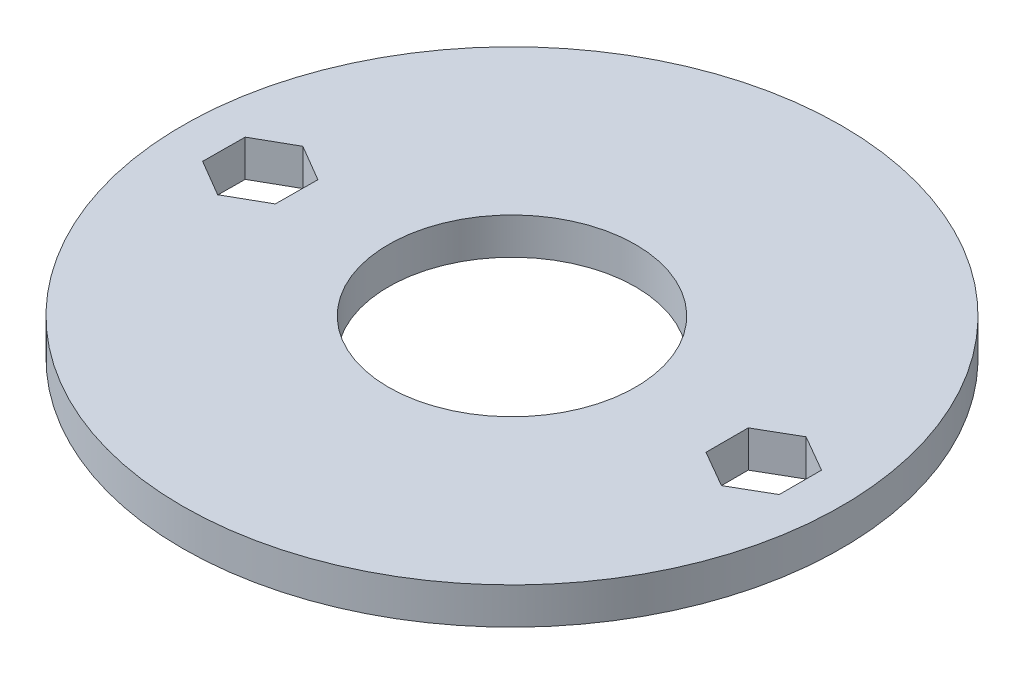
ISO-10303-21;
HEADER;
FILE_DESCRIPTION(('STEP AP214'),'2;1');
FILE_NAME('part.step','',(''),(''),'','','');
FILE_SCHEMA(('AUTOMOTIVE_DESIGN { 1 0 10303 214 1 1 1 1 }'));
ENDSEC;
DATA;
#1=APPLICATION_CONTEXT('core data for automotive mechanical design processes');
#2=APPLICATION_PROTOCOL_DEFINITION('international standard','automotive_design',2000,#1);
#3=PRODUCT_CONTEXT('',#1,'mechanical');
#4=PRODUCT('Part','Part','',(#3));
#5=PRODUCT_RELATED_PRODUCT_CATEGORY('part','',(#4));
#6=PRODUCT_DEFINITION_FORMATION('','',#4);
#7=PRODUCT_DEFINITION_CONTEXT('part definition',#1,'design');
#8=PRODUCT_DEFINITION('design','',#6,#7);
#9=PRODUCT_DEFINITION_SHAPE('','',#8);
#10=(LENGTH_UNIT() NAMED_UNIT(*) SI_UNIT(.MILLI.,.METRE.));
#11=(NAMED_UNIT(*) PLANE_ANGLE_UNIT() SI_UNIT($,.RADIAN.));
#12=(NAMED_UNIT(*) SI_UNIT($,.STERADIAN.) SOLID_ANGLE_UNIT());
#13=UNCERTAINTY_MEASURE_WITH_UNIT(LENGTH_MEASURE(1.E-05),#10,'distance_accuracy_value','');
#14=(GEOMETRIC_REPRESENTATION_CONTEXT(3) GLOBAL_UNCERTAINTY_ASSIGNED_CONTEXT((#13)) GLOBAL_UNIT_ASSIGNED_CONTEXT((#10,
#11,#12)) REPRESENTATION_CONTEXT('',''));
#15=CARTESIAN_POINT('',(0.,0.,0.));
#16=DIRECTION('',(0.,0.,1.));
#17=DIRECTION('',(1.,0.,0.));
#18=AXIS2_PLACEMENT_3D('',#15,#16,#17);
#19=CARTESIAN_POINT('',(0.,4.,0.));
#20=DIRECTION('',(0.,-1.,0.));
#21=DIRECTION('',(0.,0.,-1.));
#22=AXIS2_PLACEMENT_3D('',#19,#20,#21);
#23=CYLINDRICAL_SURFACE('',#22,36.);
#24=CARTESIAN_POINT('',(0.,4.,0.));
#25=DIRECTION('',(0.,1.,0.));
#26=DIRECTION('',(0.,0.,1.));
#27=AXIS2_PLACEMENT_3D('',#24,#25,#26);
#28=CIRCLE('',#27,36.);
#29=CARTESIAN_POINT('',(0.,4.,36.));
#30=VERTEX_POINT('',#29);
#31=EDGE_CURVE('E11',#30,#30,#28,.T.);
#32=ORIENTED_EDGE('',*,*,#31,.F.);
#33=EDGE_LOOP('',(#32));
#34=FACE_BOUND('',#33,.T.);
#35=CARTESIAN_POINT('',(0.,0.,0.));
#36=DIRECTION('',(0.,1.,0.));
#37=DIRECTION('',(0.,0.,1.));
#38=AXIS2_PLACEMENT_3D('',#35,#36,#37);
#39=CIRCLE('',#38,36.);
#40=CARTESIAN_POINT('',(0.,0.,36.));
#41=VERTEX_POINT('',#40);
#42=EDGE_CURVE('E36',#41,#41,#39,.T.);
#43=ORIENTED_EDGE('',*,*,#42,.T.);
#44=EDGE_LOOP('',(#43));
#45=FACE_BOUND('',#44,.T.);
#46=ADVANCED_FACE('F33',(#34,#45),#23,.T.);
#47=CARTESIAN_POINT('',(0.,4.,0.));
#48=DIRECTION('',(0.,1.,0.));
#49=DIRECTION('',(0.,0.,1.));
#50=AXIS2_PLACEMENT_3D('',#47,#48,#49);
#51=PLANE('',#50);
#52=CARTESIAN_POINT('',(0.,4.,0.));
#53=DIRECTION('',(0.,1.,0.));
#54=DIRECTION('',(0.,0.,1.));
#55=AXIS2_PLACEMENT_3D('',#52,#53,#54);
#56=CIRCLE('',#55,13.5);
#57=CARTESIAN_POINT('',(0.,4.,13.5));
#58=VERTEX_POINT('',#57);
#59=EDGE_CURVE('E146',#58,#58,#56,.T.);
#60=ORIENTED_EDGE('',*,*,#59,.F.);
#61=EDGE_LOOP('',(#60));
#62=FACE_BOUND('',#61,.T.);
#63=DIRECTION('',(0.866025403784439,0.,0.5));
#64=VECTOR('',#63,1.);
#65=CARTESIAN_POINT('',(23.5,4.,2.30940107675849));
#66=LINE('',#65,#64);
#67=CARTESIAN_POINT('',(23.5,4.,2.30940107675849));
#68=VERTEX_POINT('',#67);
#69=CARTESIAN_POINT('',(27.5,4.,4.618802153517));
#70=VERTEX_POINT('',#69);
#71=EDGE_CURVE('E47',#68,#70,#66,.T.);
#72=ORIENTED_EDGE('',*,*,#71,.F.);
#73=DIRECTION('',(0.,0.,1.));
#74=VECTOR('',#73,1.);
#75=CARTESIAN_POINT('',(23.5,4.,-2.30940107675851));
#76=LINE('',#75,#74);
#77=CARTESIAN_POINT('',(23.5,4.,-2.30940107675851));
#78=VERTEX_POINT('',#77);
#79=EDGE_CURVE('E140',#78,#68,#76,.T.);
#80=ORIENTED_EDGE('',*,*,#79,.F.);
#81=DIRECTION('',(-0.866025403784438,0.,0.5));
#82=VECTOR('',#81,1.);
#83=CARTESIAN_POINT('',(27.5,4.,-4.61880215351701));
#84=LINE('',#83,#82);
#85=CARTESIAN_POINT('',(27.5,4.,-4.61880215351701));
#86=VERTEX_POINT('',#85);
#87=EDGE_CURVE('E143',#86,#78,#84,.T.);
#88=ORIENTED_EDGE('',*,*,#87,.F.);
#89=DIRECTION('',(-0.866025403784439,0.,-0.5));
#90=VECTOR('',#89,1.);
#91=CARTESIAN_POINT('',(31.5,4.,-2.30940107675851));
#92=LINE('',#91,#90);
#93=CARTESIAN_POINT('',(31.5,4.,-2.30940107675851));
#94=VERTEX_POINT('',#93);
#95=EDGE_CURVE('E163',#94,#86,#92,.T.);
#96=ORIENTED_EDGE('',*,*,#95,.F.);
#97=DIRECTION('',(0.,0.,-1.));
#98=VECTOR('',#97,1.);
#99=CARTESIAN_POINT('',(31.5,4.,2.3094010767585));
#100=LINE('',#99,#98);
#101=CARTESIAN_POINT('',(31.5,4.,2.3094010767585));
#102=VERTEX_POINT('',#101);
#103=EDGE_CURVE('E160',#102,#94,#100,.T.);
#104=ORIENTED_EDGE('',*,*,#103,.F.);
#105=DIRECTION('',(0.866025403784439,0.,-0.5));
#106=VECTOR('',#105,1.);
#107=CARTESIAN_POINT('',(27.5,4.,4.618802153517));
#108=LINE('',#107,#106);
#109=EDGE_CURVE('E157',#70,#102,#108,.T.);
#110=ORIENTED_EDGE('',*,*,#109,.F.);
#111=EDGE_LOOP('',(#72,#80,#88,#96,#104,#110));
#112=FACE_BOUND('',#111,.T.);
#113=DIRECTION('',(-0.00773747927535022,0.,0.999970065259187));
#114=VECTOR('',#113,1.);
#115=CARTESIAN_POINT('',(-31.4820113180669,4.,-2.34028186253724));
#116=LINE('',#115,#114);
#117=CARTESIAN_POINT('',(-31.4820113180669,4.,-2.34028186253724));
#118=VERTEX_POINT('',#117);
#119=CARTESIAN_POINT('',(-31.5177492040066,4.,2.27838202833444));
#120=VERTEX_POINT('',#119);
#121=EDGE_CURVE('E170',#118,#120,#116,.T.);
#122=ORIENTED_EDGE('',*,*,#121,.F.);
#123=DIRECTION('',(-0.869868219176115,0.,0.493284179015884));
#124=VECTOR('',#123,1.);
#125=CARTESIAN_POINT('',(-27.4642621140602,4.,-4.61866389087167));
#126=LINE('',#125,#124);
#127=CARTESIAN_POINT('',(-27.4642621140602,4.,-4.61866389087167));
#128=VERTEX_POINT('',#127);
#129=EDGE_CURVE('E182',#128,#118,#126,.T.);
#130=ORIENTED_EDGE('',*,*,#129,.F.);
#131=DIRECTION('',(-0.862130739900764,0.,-0.506685886243303));
#132=VECTOR('',#131,1.);
#133=CARTESIAN_POINT('',(-23.4822507959934,4.,-2.27838202833443));
#134=LINE('',#133,#132);
#135=CARTESIAN_POINT('',(-23.4822507959934,4.,-2.27838202833443));
#136=VERTEX_POINT('',#135);
#137=EDGE_CURVE('E208',#136,#128,#134,.T.);
#138=ORIENTED_EDGE('',*,*,#137,.F.);
#139=DIRECTION('',(0.00773747927535098,0.,-0.999970065259187));
#140=VECTOR('',#139,1.);
#141=CARTESIAN_POINT('',(-23.5179886819331,4.,2.34028186253724));
#142=LINE('',#141,#140);
#143=CARTESIAN_POINT('',(-23.5179886819331,4.,2.34028186253724));
#144=VERTEX_POINT('',#143);
#145=EDGE_CURVE('E205',#144,#136,#142,.T.);
#146=ORIENTED_EDGE('',*,*,#145,.F.);
#147=DIRECTION('',(0.869868219176115,0.,-0.493284179015884));
#148=VECTOR('',#147,1.);
#149=CARTESIAN_POINT('',(-27.5357378859398,4.,4.61866389087168));
#150=LINE('',#149,#148);
#151=CARTESIAN_POINT('',(-27.5357378859398,4.,4.61866389087168));
#152=VERTEX_POINT('',#151);
#153=EDGE_CURVE('E202',#152,#144,#150,.T.);
#154=ORIENTED_EDGE('',*,*,#153,.F.);
#155=DIRECTION('',(0.862130739900764,0.,0.506685886243304));
#156=VECTOR('',#155,1.);
#157=CARTESIAN_POINT('',(-31.5177492040066,4.,2.27838202833444));
#158=LINE('',#157,#156);
#159=EDGE_CURVE('E199',#120,#152,#158,.T.);
#160=ORIENTED_EDGE('',*,*,#159,.F.);
#161=EDGE_LOOP('',(#122,#130,#138,#146,#154,#160));
#162=FACE_BOUND('',#161,.T.);
#163=ORIENTED_EDGE('',*,*,#31,.T.);
#164=EDGE_LOOP('',(#163));
#165=FACE_BOUND('',#164,.T.);
#166=ADVANCED_FACE('F234',(#62,#112,#162,#165),#51,.T.);
#167=CARTESIAN_POINT('',(0.,0.,0.));
#168=DIRECTION('',(0.,1.,0.));
#169=DIRECTION('',(0.,0.,1.));
#170=AXIS2_PLACEMENT_3D('',#167,#168,#169);
#171=PLANE('',#170);
#172=CARTESIAN_POINT('',(0.,0.,0.));
#173=DIRECTION('',(0.,1.,0.));
#174=DIRECTION('',(0.,0.,1.));
#175=AXIS2_PLACEMENT_3D('',#172,#173,#174);
#176=CIRCLE('',#175,13.5);
#177=CARTESIAN_POINT('',(0.,0.,13.5));
#178=VERTEX_POINT('',#177);
#179=EDGE_CURVE('E158',#178,#178,#176,.T.);
#180=ORIENTED_EDGE('',*,*,#179,.T.);
#181=EDGE_LOOP('',(#180));
#182=FACE_BOUND('',#181,.T.);
#183=DIRECTION('',(0.,0.,1.));
#184=VECTOR('',#183,1.);
#185=CARTESIAN_POINT('',(23.5,0.,-2.30940107675851));
#186=LINE('',#185,#184);
#187=CARTESIAN_POINT('',(23.5,0.,-2.30940107675851));
#188=VERTEX_POINT('',#187);
#189=CARTESIAN_POINT('',(23.5,0.,2.30940107675849));
#190=VERTEX_POINT('',#189);
#191=EDGE_CURVE('E129',#188,#190,#186,.T.);
#192=ORIENTED_EDGE('',*,*,#191,.T.);
#193=DIRECTION('',(0.866025403784439,0.,0.5));
#194=VECTOR('',#193,1.);
#195=CARTESIAN_POINT('',(23.5,0.,2.30940107675849));
#196=LINE('',#195,#194);
#197=CARTESIAN_POINT('',(27.5,0.,4.618802153517));
#198=VERTEX_POINT('',#197);
#199=EDGE_CURVE('E123',#190,#198,#196,.T.);
#200=ORIENTED_EDGE('',*,*,#199,.T.);
#201=DIRECTION('',(0.866025403784439,0.,-0.5));
#202=VECTOR('',#201,1.);
#203=CARTESIAN_POINT('',(27.5,0.,4.618802153517));
#204=LINE('',#203,#202);
#205=CARTESIAN_POINT('',(31.5,0.,2.3094010767585));
#206=VERTEX_POINT('',#205);
#207=EDGE_CURVE('E132',#198,#206,#204,.T.);
#208=ORIENTED_EDGE('',*,*,#207,.T.);
#209=DIRECTION('',(0.,0.,-1.));
#210=VECTOR('',#209,1.);
#211=CARTESIAN_POINT('',(31.5,0.,2.3094010767585));
#212=LINE('',#211,#210);
#213=CARTESIAN_POINT('',(31.5,0.,-2.30940107675851));
#214=VERTEX_POINT('',#213);
#215=EDGE_CURVE('E55',#206,#214,#212,.T.);
#216=ORIENTED_EDGE('',*,*,#215,.T.);
#217=DIRECTION('',(-0.866025403784439,0.,-0.5));
#218=VECTOR('',#217,1.);
#219=CARTESIAN_POINT('',(31.5,0.,-2.30940107675851));
#220=LINE('',#219,#218);
#221=CARTESIAN_POINT('',(27.5,0.,-4.61880215351701));
#222=VERTEX_POINT('',#221);
#223=EDGE_CURVE('E150',#214,#222,#220,.T.);
#224=ORIENTED_EDGE('',*,*,#223,.T.);
#225=DIRECTION('',(-0.866025403784438,0.,0.5));
#226=VECTOR('',#225,1.);
#227=CARTESIAN_POINT('',(27.5,0.,-4.61880215351701));
#228=LINE('',#227,#226);
#229=EDGE_CURVE('E153',#222,#188,#228,.T.);
#230=ORIENTED_EDGE('',*,*,#229,.T.);
#231=EDGE_LOOP('',(#192,#200,#208,#216,#224,#230));
#232=FACE_BOUND('',#231,.T.);
#233=DIRECTION('',(-0.869868219176115,0.,0.493284179015884));
#234=VECTOR('',#233,1.);
#235=CARTESIAN_POINT('',(-27.4642621140602,0.,-4.61866389087167));
#236=LINE('',#235,#234);
#237=CARTESIAN_POINT('',(-27.4642621140602,0.,-4.61866389087167));
#238=VERTEX_POINT('',#237);
#239=CARTESIAN_POINT('',(-31.4820113180669,0.,-2.34028186253724));
#240=VERTEX_POINT('',#239);
#241=EDGE_CURVE('E194',#238,#240,#236,.T.);
#242=ORIENTED_EDGE('',*,*,#241,.T.);
#243=DIRECTION('',(-0.00773747927535022,0.,0.999970065259187));
#244=VECTOR('',#243,1.);
#245=CARTESIAN_POINT('',(-31.4820113180669,0.,-2.34028186253724));
#246=LINE('',#245,#244);
#247=CARTESIAN_POINT('',(-31.5177492040066,0.,2.27838202833444));
#248=VERTEX_POINT('',#247);
#249=EDGE_CURVE('E178',#240,#248,#246,.T.);
#250=ORIENTED_EDGE('',*,*,#249,.T.);
#251=DIRECTION('',(0.862130739900764,0.,0.506685886243304));
#252=VECTOR('',#251,1.);
#253=CARTESIAN_POINT('',(-31.5177492040066,0.,2.27838202833444));
#254=LINE('',#253,#252);
#255=CARTESIAN_POINT('',(-27.5357378859398,0.,4.61866389087168));
#256=VERTEX_POINT('',#255);
#257=EDGE_CURVE('E181',#248,#256,#254,.T.);
#258=ORIENTED_EDGE('',*,*,#257,.T.);
#259=DIRECTION('',(0.869868219176115,0.,-0.493284179015884));
#260=VECTOR('',#259,1.);
#261=CARTESIAN_POINT('',(-27.5357378859398,0.,4.61866389087168));
#262=LINE('',#261,#260);
#263=CARTESIAN_POINT('',(-23.5179886819331,0.,2.34028186253724));
#264=VERTEX_POINT('',#263);
#265=EDGE_CURVE('E185',#256,#264,#262,.T.);
#266=ORIENTED_EDGE('',*,*,#265,.T.);
#267=DIRECTION('',(0.00773747927535098,0.,-0.999970065259187));
#268=VECTOR('',#267,1.);
#269=CARTESIAN_POINT('',(-23.5179886819331,0.,2.34028186253724));
#270=LINE('',#269,#268);
#271=CARTESIAN_POINT('',(-23.4822507959934,0.,-2.27838202833443));
#272=VERTEX_POINT('',#271);
#273=EDGE_CURVE('E188',#264,#272,#270,.T.);
#274=ORIENTED_EDGE('',*,*,#273,.T.);
#275=DIRECTION('',(-0.862130739900764,0.,-0.506685886243303));
#276=VECTOR('',#275,1.);
#277=CARTESIAN_POINT('',(-23.4822507959934,0.,-2.27838202833443));
#278=LINE('',#277,#276);
#279=EDGE_CURVE('E191',#272,#238,#278,.T.);
#280=ORIENTED_EDGE('',*,*,#279,.T.);
#281=EDGE_LOOP('',(#242,#250,#258,#266,#274,#280));
#282=FACE_BOUND('',#281,.T.);
#283=ORIENTED_EDGE('',*,*,#42,.F.);
#284=EDGE_LOOP('',(#283));
#285=FACE_BOUND('',#284,.T.);
#286=ADVANCED_FACE('F136',(#182,#232,#282,#285),#171,.F.);
#287=CARTESIAN_POINT('',(-31.4820113180669,0.,-2.34028186253724));
#288=DIRECTION('',(-0.999970065259188,0.,-0.00773747927535022));
#289=DIRECTION('',(-0.00773747927535022,0.,0.999970065259187));
#290=AXIS2_PLACEMENT_3D('',#287,#288,#289);
#291=PLANE('',#290);
#292=ORIENTED_EDGE('',*,*,#121,.T.);
#293=DIRECTION('',(0.,1.,0.));
#294=VECTOR('',#293,1.);
#295=CARTESIAN_POINT('',(-31.5177492040066,0.,2.27838202833444));
#296=LINE('',#295,#294);
#297=EDGE_CURVE('E197',#248,#120,#296,.T.);
#298=ORIENTED_EDGE('',*,*,#297,.F.);
#299=ORIENTED_EDGE('',*,*,#249,.F.);
#300=DIRECTION('',(0.,1.,0.));
#301=VECTOR('',#300,1.);
#302=CARTESIAN_POINT('',(-31.4820113180669,0.,-2.34028186253724));
#303=LINE('',#302,#301);
#304=EDGE_CURVE('E213',#240,#118,#303,.T.);
#305=ORIENTED_EDGE('',*,*,#304,.T.);
#306=EDGE_LOOP('',(#292,#298,#299,#305));
#307=FACE_BOUND('',#306,.T.);
#308=ADVANCED_FACE('F244',(#307),#291,.F.);
#309=CARTESIAN_POINT('',(-27.4642621140602,0.,-4.61866389087167));
#310=DIRECTION('',(-0.493284179015884,0.,-0.869868219176115));
#311=DIRECTION('',(-0.869868219176115,0.,0.493284179015884));
#312=AXIS2_PLACEMENT_3D('',#309,#310,#311);
#313=PLANE('',#312);
#314=ORIENTED_EDGE('',*,*,#129,.T.);
#315=ORIENTED_EDGE('',*,*,#304,.F.);
#316=ORIENTED_EDGE('',*,*,#241,.F.);
#317=DIRECTION('',(0.,1.,0.));
#318=VECTOR('',#317,1.);
#319=CARTESIAN_POINT('',(-27.4642621140602,0.,-4.61866389087167));
#320=LINE('',#319,#318);
#321=EDGE_CURVE('E215',#238,#128,#320,.T.);
#322=ORIENTED_EDGE('',*,*,#321,.T.);
#323=EDGE_LOOP('',(#314,#315,#316,#322));
#324=FACE_BOUND('',#323,.T.);
#325=ADVANCED_FACE('F246',(#324),#313,.F.);
#326=CARTESIAN_POINT('',(-23.4822507959934,0.,-2.27838202833443));
#327=DIRECTION('',(0.506685886243303,0.,-0.862130739900764));
#328=DIRECTION('',(-0.862130739900764,0.,-0.506685886243303));
#329=AXIS2_PLACEMENT_3D('',#326,#327,#328);
#330=PLANE('',#329);
#331=ORIENTED_EDGE('',*,*,#137,.T.);
#332=ORIENTED_EDGE('',*,*,#321,.F.);
#333=ORIENTED_EDGE('',*,*,#279,.F.);
#334=DIRECTION('',(0.,1.,0.));
#335=VECTOR('',#334,1.);
#336=CARTESIAN_POINT('',(-23.4822507959934,0.,-2.27838202833443));
#337=LINE('',#336,#335);
#338=EDGE_CURVE('E217',#272,#136,#337,.T.);
#339=ORIENTED_EDGE('',*,*,#338,.T.);
#340=EDGE_LOOP('',(#331,#332,#333,#339));
#341=FACE_BOUND('',#340,.T.);
#342=ADVANCED_FACE('F248',(#341),#330,.F.);
#343=CARTESIAN_POINT('',(-23.5179886819331,0.,2.34028186253724));
#344=DIRECTION('',(0.999970065259188,0.,0.00773747927535098));
#345=DIRECTION('',(0.00773747927535098,0.,-0.999970065259187));
#346=AXIS2_PLACEMENT_3D('',#343,#344,#345);
#347=PLANE('',#346);
#348=ORIENTED_EDGE('',*,*,#145,.T.);
#349=ORIENTED_EDGE('',*,*,#338,.F.);
#350=ORIENTED_EDGE('',*,*,#273,.F.);
#351=DIRECTION('',(0.,1.,0.));
#352=VECTOR('',#351,1.);
#353=CARTESIAN_POINT('',(-23.5179886819331,0.,2.34028186253724));
#354=LINE('',#353,#352);
#355=EDGE_CURVE('E219',#264,#144,#354,.T.);
#356=ORIENTED_EDGE('',*,*,#355,.T.);
#357=EDGE_LOOP('',(#348,#349,#350,#356));
#358=FACE_BOUND('',#357,.T.);
#359=ADVANCED_FACE('F251',(#358),#347,.F.);
#360=CARTESIAN_POINT('',(-27.5357378859398,0.,4.61866389087168));
#361=DIRECTION('',(0.493284179015884,0.,0.869868219176115));
#362=DIRECTION('',(0.869868219176115,0.,-0.493284179015884));
#363=AXIS2_PLACEMENT_3D('',#360,#361,#362);
#364=PLANE('',#363);
#365=ORIENTED_EDGE('',*,*,#153,.T.);
#366=ORIENTED_EDGE('',*,*,#355,.F.);
#367=ORIENTED_EDGE('',*,*,#265,.F.);
#368=DIRECTION('',(0.,1.,0.));
#369=VECTOR('',#368,1.);
#370=CARTESIAN_POINT('',(-27.5357378859398,0.,4.61866389087168));
#371=LINE('',#370,#369);
#372=EDGE_CURVE('E221',#256,#152,#371,.T.);
#373=ORIENTED_EDGE('',*,*,#372,.T.);
#374=EDGE_LOOP('',(#365,#366,#367,#373));
#375=FACE_BOUND('',#374,.T.);
#376=ADVANCED_FACE('F240',(#375),#364,.F.);
#377=CARTESIAN_POINT('',(-31.5177492040066,0.,2.27838202833444));
#378=DIRECTION('',(-0.506685886243304,0.,0.862130739900764));
#379=DIRECTION('',(0.862130739900764,0.,0.506685886243304));
#380=AXIS2_PLACEMENT_3D('',#377,#378,#379);
#381=PLANE('',#380);
#382=ORIENTED_EDGE('',*,*,#159,.T.);
#383=ORIENTED_EDGE('',*,*,#372,.F.);
#384=ORIENTED_EDGE('',*,*,#257,.F.);
#385=ORIENTED_EDGE('',*,*,#297,.T.);
#386=EDGE_LOOP('',(#382,#383,#384,#385));
#387=FACE_BOUND('',#386,.T.);
#388=ADVANCED_FACE('F227',(#387),#381,.F.);
#389=CARTESIAN_POINT('',(23.5,0.,2.30940107675849));
#390=DIRECTION('',(-0.5,0.,0.866025403784439));
#391=DIRECTION('',(0.866025403784439,0.,0.5));
#392=AXIS2_PLACEMENT_3D('',#389,#390,#391);
#393=PLANE('',#392);
#394=ORIENTED_EDGE('',*,*,#71,.T.);
#395=DIRECTION('',(0.,1.,0.));
#396=VECTOR('',#395,1.);
#397=CARTESIAN_POINT('',(27.5,0.,4.618802153517));
#398=LINE('',#397,#396);
#399=EDGE_CURVE('E119',#198,#70,#398,.T.);
#400=ORIENTED_EDGE('',*,*,#399,.F.);
#401=ORIENTED_EDGE('',*,*,#199,.F.);
#402=DIRECTION('',(0.,1.,0.));
#403=VECTOR('',#402,1.);
#404=CARTESIAN_POINT('',(23.5,0.,2.30940107675849));
#405=LINE('',#404,#403);
#406=EDGE_CURVE('E168',#190,#68,#405,.T.);
#407=ORIENTED_EDGE('',*,*,#406,.T.);
#408=EDGE_LOOP('',(#394,#400,#401,#407));
#409=FACE_BOUND('',#408,.T.);
#410=ADVANCED_FACE('F121',(#409),#393,.F.);
#411=CARTESIAN_POINT('',(23.5,0.,-2.30940107675851));
#412=DIRECTION('',(-1.,0.,0.));
#413=DIRECTION('',(0.,0.,1.));
#414=AXIS2_PLACEMENT_3D('',#411,#412,#413);
#415=PLANE('',#414);
#416=ORIENTED_EDGE('',*,*,#79,.T.);
#417=ORIENTED_EDGE('',*,*,#406,.F.);
#418=ORIENTED_EDGE('',*,*,#191,.F.);
#419=DIRECTION('',(0.,1.,0.));
#420=VECTOR('',#419,1.);
#421=CARTESIAN_POINT('',(23.5,0.,-2.30940107675851));
#422=LINE('',#421,#420);
#423=EDGE_CURVE('E171',#188,#78,#422,.T.);
#424=ORIENTED_EDGE('',*,*,#423,.T.);
#425=EDGE_LOOP('',(#416,#417,#418,#424));
#426=FACE_BOUND('',#425,.T.);
#427=ADVANCED_FACE('F283',(#426),#415,.F.);
#428=CARTESIAN_POINT('',(27.5,0.,-4.61880215351701));
#429=DIRECTION('',(-0.5,0.,-0.866025403784438));
#430=DIRECTION('',(-0.866025403784438,0.,0.5));
#431=AXIS2_PLACEMENT_3D('',#428,#429,#430);
#432=PLANE('',#431);
#433=ORIENTED_EDGE('',*,*,#87,.T.);
#434=ORIENTED_EDGE('',*,*,#423,.F.);
#435=ORIENTED_EDGE('',*,*,#229,.F.);
#436=DIRECTION('',(0.,1.,0.));
#437=VECTOR('',#436,1.);
#438=CARTESIAN_POINT('',(27.5,0.,-4.61880215351701));
#439=LINE('',#438,#437);
#440=EDGE_CURVE('E173',#222,#86,#439,.T.);
#441=ORIENTED_EDGE('',*,*,#440,.T.);
#442=EDGE_LOOP('',(#433,#434,#435,#441));
#443=FACE_BOUND('',#442,.T.);
#444=ADVANCED_FACE('F288',(#443),#432,.F.);
#445=CARTESIAN_POINT('',(31.5,0.,-2.30940107675851));
#446=DIRECTION('',(0.5,0.,-0.866025403784439));
#447=DIRECTION('',(-0.866025403784439,0.,-0.5));
#448=AXIS2_PLACEMENT_3D('',#445,#446,#447);
#449=PLANE('',#448);
#450=ORIENTED_EDGE('',*,*,#95,.T.);
#451=ORIENTED_EDGE('',*,*,#440,.F.);
#452=ORIENTED_EDGE('',*,*,#223,.F.);
#453=DIRECTION('',(0.,1.,0.));
#454=VECTOR('',#453,1.);
#455=CARTESIAN_POINT('',(31.5,0.,-2.30940107675851));
#456=LINE('',#455,#454);
#457=EDGE_CURVE('E175',#214,#94,#456,.T.);
#458=ORIENTED_EDGE('',*,*,#457,.T.);
#459=EDGE_LOOP('',(#450,#451,#452,#458));
#460=FACE_BOUND('',#459,.T.);
#461=ADVANCED_FACE('F336',(#460),#449,.F.);
#462=CARTESIAN_POINT('',(31.5,0.,2.3094010767585));
#463=DIRECTION('',(1.,0.,0.));
#464=DIRECTION('',(0.,0.,-1.));
#465=AXIS2_PLACEMENT_3D('',#462,#463,#464);
#466=PLANE('',#465);
#467=ORIENTED_EDGE('',*,*,#103,.T.);
#468=ORIENTED_EDGE('',*,*,#457,.F.);
#469=ORIENTED_EDGE('',*,*,#215,.F.);
#470=DIRECTION('',(0.,1.,0.));
#471=VECTOR('',#470,1.);
#472=CARTESIAN_POINT('',(31.5,0.,2.3094010767585));
#473=LINE('',#472,#471);
#474=EDGE_CURVE('E128',#206,#102,#473,.T.);
#475=ORIENTED_EDGE('',*,*,#474,.T.);
#476=EDGE_LOOP('',(#467,#468,#469,#475));
#477=FACE_BOUND('',#476,.T.);
#478=ADVANCED_FACE('F346',(#477),#466,.F.);
#479=CARTESIAN_POINT('',(27.5,0.,4.618802153517));
#480=DIRECTION('',(0.5,0.,0.866025403784439));
#481=DIRECTION('',(0.866025403784439,0.,-0.5));
#482=AXIS2_PLACEMENT_3D('',#479,#480,#481);
#483=PLANE('',#482);
#484=ORIENTED_EDGE('',*,*,#109,.T.);
#485=ORIENTED_EDGE('',*,*,#474,.F.);
#486=ORIENTED_EDGE('',*,*,#207,.F.);
#487=ORIENTED_EDGE('',*,*,#399,.T.);
#488=EDGE_LOOP('',(#484,#485,#486,#487));
#489=FACE_BOUND('',#488,.T.);
#490=ADVANCED_FACE('F133',(#489),#483,.F.);
#491=CARTESIAN_POINT('',(0.,0.,0.));
#492=DIRECTION('',(0.,1.,0.));
#493=DIRECTION('',(0.,0.,1.));
#494=AXIS2_PLACEMENT_3D('',#491,#492,#493);
#495=CYLINDRICAL_SURFACE('',#494,13.5);
#496=ORIENTED_EDGE('',*,*,#179,.F.);
#497=EDGE_LOOP('',(#496));
#498=FACE_BOUND('',#497,.T.);
#499=ORIENTED_EDGE('',*,*,#59,.T.);
#500=EDGE_LOOP('',(#499));
#501=FACE_BOUND('',#500,.T.);
#502=ADVANCED_FACE('F363',(#498,#501),#495,.F.);
#503=CLOSED_SHELL('',(#46,#166,#286,#308,#325,#342,#359,#376,#388,#410,#427,#444,#461,#478,#490,#502));
#504=MANIFOLD_SOLID_BREP('B2',#503);
#505=ADVANCED_BREP_SHAPE_REPRESENTATION('',(#18,#504),#14);
#506=SHAPE_DEFINITION_REPRESENTATION(#9,#505);
ENDSEC;
END-ISO-10303-21;
